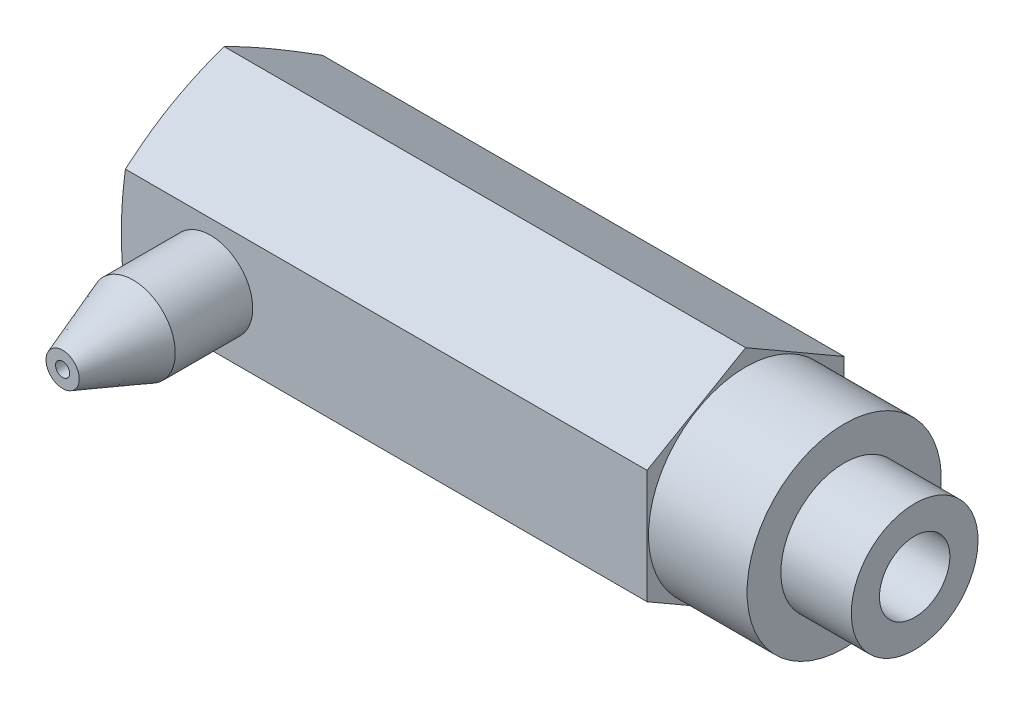
ISO-10303-21;
HEADER;
FILE_DESCRIPTION(('STEP AP214'),'2;1');
FILE_NAME('part.step','',(''),(''),'','','');
FILE_SCHEMA(('AUTOMOTIVE_DESIGN { 1 0 10303 214 1 1 1 1 }'));
ENDSEC;
DATA;
#1=APPLICATION_CONTEXT('core data for automotive mechanical design processes');
#2=APPLICATION_PROTOCOL_DEFINITION('international standard','automotive_design',2000,#1);
#3=PRODUCT_CONTEXT('',#1,'mechanical');
#4=PRODUCT('Part','Part','',(#3));
#5=PRODUCT_RELATED_PRODUCT_CATEGORY('part','',(#4));
#6=PRODUCT_DEFINITION_FORMATION('','',#4);
#7=PRODUCT_DEFINITION_CONTEXT('part definition',#1,'design');
#8=PRODUCT_DEFINITION('design','',#6,#7);
#9=PRODUCT_DEFINITION_SHAPE('','',#8);
#10=(LENGTH_UNIT() NAMED_UNIT(*) SI_UNIT(.MILLI.,.METRE.));
#11=(NAMED_UNIT(*) PLANE_ANGLE_UNIT() SI_UNIT($,.RADIAN.));
#12=(NAMED_UNIT(*) SI_UNIT($,.STERADIAN.) SOLID_ANGLE_UNIT());
#13=UNCERTAINTY_MEASURE_WITH_UNIT(LENGTH_MEASURE(1.E-05),#10,'distance_accuracy_value','');
#14=(GEOMETRIC_REPRESENTATION_CONTEXT(3) GLOBAL_UNCERTAINTY_ASSIGNED_CONTEXT((#13)) GLOBAL_UNIT_ASSIGNED_CONTEXT((#10,
#11,#12)) REPRESENTATION_CONTEXT('',''));
#15=CARTESIAN_POINT('',(0.,0.,0.));
#16=DIRECTION('',(0.,0.,1.));
#17=DIRECTION('',(1.,0.,0.));
#18=AXIS2_PLACEMENT_3D('',#15,#16,#17);
#19=CARTESIAN_POINT('',(0.,-12.1243556529821,-7.00000000000001));
#20=DIRECTION('',(1.,0.,0.));
#21=DIRECTION('',(0.,1.,0.));
#22=AXIS2_PLACEMENT_3D('',#19,#20,#21);
#23=PLANE('',#22);
#24=CARTESIAN_POINT('',(2.84220346910558E-11,0.,0.));
#25=DIRECTION('',(1.,0.,0.));
#26=DIRECTION('',(0.,0.,-1.));
#27=AXIS2_PLACEMENT_3D('',#24,#25,#26);
#28=CIRCLE('',#27,4.50000000000728);
#29=CARTESIAN_POINT('',(2.84220346910558E-11,0.,-4.50000000000728));
#30=VERTEX_POINT('',#29);
#31=EDGE_CURVE('E21',#30,#30,#28,.T.);
#32=ORIENTED_EDGE('',*,*,#31,.F.);
#33=EDGE_LOOP('',(#32));
#34=FACE_BOUND('',#33,.T.);
#35=ADVANCED_FACE('F18',(#34),#23,.F.);
#36=CARTESIAN_POINT('',(0.965796388413764,0.,0.));
#37=DIRECTION('',(1.,0.,0.));
#38=DIRECTION('',(0.,0.,-1.));
#39=AXIS2_PLACEMENT_3D('',#36,#37,#38);
#40=CONICAL_SURFACE('',#39,8.10440119124678,1.30899693899706);
#41=ORIENTED_EDGE('',*,*,#31,.T.);
#42=EDGE_LOOP('',(#41));
#43=FACE_BOUND('',#42,.T.);
#44=CARTESIAN_POINT('',(0.960036171390529,-8.08290376865333,2.45904720954475E-12));
#45=CARTESIAN_POINT('',(0.915048871987768,-7.91507240446687,0.290692449876997));
#46=CARTESIAN_POINT('',(0.874207965908697,-7.7469367613631,0.581911926296008));
#47=CARTESIAN_POINT('',(0.802454490572628,-7.41007174498889,1.16537924994865));
#48=CARTESIAN_POINT('',(0.771545953213827,-7.24134215864227,1.45762746624108));
#49=CARTESIAN_POINT('',(0.721461485342798,-6.90431216735326,2.04138053482815));
#50=CARTESIAN_POINT('',(0.702225832356052,-6.736014040957,2.33288144056511));
#51=CARTESIAN_POINT('',(0.676432806463181,-6.39920318665398,2.91625495275862));
#52=CARTESIAN_POINT('',(0.669872981100767,-6.23069050657251,3.20812747637934));
#53=CARTESIAN_POINT('',(0.669872981100769,-5.89366514640956,3.79187252362077));
#54=CARTESIAN_POINT('',(0.676432806463184,-5.72515246632808,4.08374504724148));
#55=CARTESIAN_POINT('',(0.702225832356058,-5.38834161202506,4.66711855943499));
#56=CARTESIAN_POINT('',(0.721461485342807,-5.22004348562881,4.95861946517195));
#57=CARTESIAN_POINT('',(0.771545953213838,-4.8830134943398,5.54237253375902));
#58=CARTESIAN_POINT('',(0.802454490572641,-4.71428390799317,5.83462075005145));
#59=CARTESIAN_POINT('',(0.874207965908712,-4.37741889161897,6.41808807370409));
#60=CARTESIAN_POINT('',(0.915048871987785,-4.20928324851519,6.7093075501231));
#61=CARTESIAN_POINT('',(0.960036171390547,-4.04145188432874,6.99999999999764));
#62=B_SPLINE_CURVE_WITH_KNOTS('',3,(#44,#45,#46,#47,#48,#49,#50,#51,#52,#53,#54,#55,#56,#57,#58,
#59,#60,#61),.UNSPECIFIED.,.F.,.F.,(4,2,2,2,2,2,2,2,4),(0.,1.01604530703988,2.0325025431513,
3.04371439847408,4.05473058994357,5.06574678141305,6.07695863673583,7.09341587284725,
8.10946117988713),.UNSPECIFIED.);
#63=CARTESIAN_POINT('',(0.960036171390716,-8.08290376865403,1.22941724914971E-12));
#64=VERTEX_POINT('',#63);
#65=CARTESIAN_POINT('',(0.960036171390543,-4.04145188432661,6.99999999999885));
#66=VERTEX_POINT('',#65);
#67=EDGE_CURVE('E67',#64,#66,#62,.T.);
#68=ORIENTED_EDGE('',*,*,#67,.T.);
#69=CARTESIAN_POINT('',(0.960036171390538,-4.04145188432448,7.00000000000006));
#70=CARTESIAN_POINT('',(0.915048871987779,-3.70578915595158,7.00000000000006));
#71=CARTESIAN_POINT('',(0.87420796590871,-3.36951786974403,7.00000000000006));
#72=CARTESIAN_POINT('',(0.802454490572644,-2.69578783699564,7.00000000000006));
#73=CARTESIAN_POINT('',(0.771545953213844,-2.3583286643024,7.00000000000006));
#74=CARTESIAN_POINT('',(0.721461485342818,-1.6842686817244,7.00000000000006));
#75=CARTESIAN_POINT('',(0.702225832356071,-1.3476724289319,7.00000000000006));
#76=CARTESIAN_POINT('',(0.676432806463201,-0.674050720325877,7.00000000000006));
#77=CARTESIAN_POINT('',(0.669872981100787,-0.337025360162938,7.00000000000006));
#78=CARTESIAN_POINT('',(0.669872981100787,0.337025360162938,7.00000000000006));
#79=CARTESIAN_POINT('',(0.676432806463201,0.674050720325876,7.00000000000006));
#80=CARTESIAN_POINT('',(0.702225832356071,1.3476724289319,7.00000000000006));
#81=CARTESIAN_POINT('',(0.721461485342817,1.68426868172439,7.00000000000006));
#82=CARTESIAN_POINT('',(0.771545953213844,2.3583286643024,7.00000000000006));
#83=CARTESIAN_POINT('',(0.802454490572643,2.69578783699563,7.00000000000006));
#84=CARTESIAN_POINT('',(0.874207965908709,3.36951786974402,7.00000000000006));
#85=CARTESIAN_POINT('',(0.915048871987778,3.70578915595157,7.00000000000006));
#86=CARTESIAN_POINT('',(0.960036171390536,4.04145188432447,7.00000000000006));
#87=B_SPLINE_CURVE_WITH_KNOTS('',3,(#69,#70,#71,#72,#73,#74,#75,#76,#77,#78,#79,#80,#81,#82,#83,
#84,#85,#86),.UNSPECIFIED.,.F.,.F.,(4,2,2,2,2,2,2,2,4),(0.,1.01604530703985,2.03250254315124,
3.04371439847399,4.05473058994345,5.0657467814129,6.07695863673565,7.09341587284703,
8.10946117988688),.UNSPECIFIED.);
#88=CARTESIAN_POINT('',(0.960036171390735,4.04145188432801,6.99999999999887));
#89=VERTEX_POINT('',#88);
#90=EDGE_CURVE('E128',#66,#89,#87,.T.);
#91=ORIENTED_EDGE('',*,*,#90,.T.);
#92=CARTESIAN_POINT('',(0.96003617139056,4.04145188432878,6.99999999999767));
#93=CARTESIAN_POINT('',(0.915048871987798,4.20928324851523,6.70930755012314));
#94=CARTESIAN_POINT('',(0.874207965908726,4.37741889161901,6.41808807370413));
#95=CARTESIAN_POINT('',(0.802454490572654,4.71428390799321,5.83462075005149));
#96=CARTESIAN_POINT('',(0.771545953213852,4.88301349433983,5.54237253375905));
#97=CARTESIAN_POINT('',(0.721461485342821,5.22004348562885,4.95861946517199));
#98=CARTESIAN_POINT('',(0.702225832356073,5.3883416120251,4.66711855943503));
#99=CARTESIAN_POINT('',(0.676432806463198,5.72515246632812,4.08374504724152));
#100=CARTESIAN_POINT('',(0.669872981100783,5.8936651464096,3.7918725236208));
#101=CARTESIAN_POINT('',(0.669872981100781,6.23069050657254,3.20812747637938));
#102=CARTESIAN_POINT('',(0.676432806463195,6.39920318665402,2.91625495275867));
#103=CARTESIAN_POINT('',(0.702225832356065,6.73601404095704,2.33288144056516));
#104=CARTESIAN_POINT('',(0.721461485342811,6.90431216735329,2.04138053482819));
#105=CARTESIAN_POINT('',(0.771545953213839,7.24134215864231,1.45762746624113));
#106=CARTESIAN_POINT('',(0.802454490572639,7.41007174498893,1.1653792499487));
#107=CARTESIAN_POINT('',(0.874207965908707,7.74693676136313,0.581911926296054));
#108=CARTESIAN_POINT('',(0.915048871987778,7.91507240446691,0.290692449877043));
#109=CARTESIAN_POINT('',(0.960036171390539,8.08290376865336,2.5059798162903E-12));
#110=B_SPLINE_CURVE_WITH_KNOTS('',3,(#92,#93,#94,#95,#96,#97,#98,#99,#100,#101,#102,#103,#104,
#105,#106,#107,#108,#109),.UNSPECIFIED.,.F.,.F.,(4,2,2,2,2,2,2,2,4),(0.,1.01604530703988,
2.03250254315129,3.04371439847407,4.05473058994356,5.06574678141304,6.07695863673582,
7.09341587284723,8.10946117988712),.UNSPECIFIED.);
#111=CARTESIAN_POINT('',(0.960036171390728,8.08290376865407,-1.16869140979691E-12));
#112=VERTEX_POINT('',#111);
#113=EDGE_CURVE('E116',#89,#112,#110,.T.);
#114=ORIENTED_EDGE('',*,*,#113,.T.);
#115=CARTESIAN_POINT('',(0.960036171390538,8.08290376865336,-2.39294052244843E-12));
#116=CARTESIAN_POINT('',(0.915048871987777,7.91507240446691,-0.29069244987693));
#117=CARTESIAN_POINT('',(0.874207965908704,7.74693676136313,-0.581911926295942));
#118=CARTESIAN_POINT('',(0.802454490572634,7.41007174498893,-1.16537924994859));
#119=CARTESIAN_POINT('',(0.771545953213832,7.2413421586423,-1.45762746624102));
#120=CARTESIAN_POINT('',(0.721461485342801,6.90431216735329,-2.04138053482809));
#121=CARTESIAN_POINT('',(0.702225832356054,6.73601404095703,-2.33288144056505));
#122=CARTESIAN_POINT('',(0.676432806463181,6.39920318665401,-2.91625495275856));
#123=CARTESIAN_POINT('',(0.669872981100767,6.23069050657254,-3.20812747637928));
#124=CARTESIAN_POINT('',(0.669872981100767,5.89366514640959,-3.7918725236207));
#125=CARTESIAN_POINT('',(0.676432806463181,5.72515246632811,-4.08374504724142));
#126=CARTESIAN_POINT('',(0.702225832356054,5.38834161202509,-4.66711855943493));
#127=CARTESIAN_POINT('',(0.721461485342801,5.22004348562884,-4.95861946517189));
#128=CARTESIAN_POINT('',(0.771545953213831,4.88301349433982,-5.54237253375896));
#129=CARTESIAN_POINT('',(0.802454490572633,4.7142839079932,-5.83462075005139));
#130=CARTESIAN_POINT('',(0.874207965908703,4.377418891619,-6.41808807370404));
#131=CARTESIAN_POINT('',(0.915048871987775,4.20928324851522,-6.70930755012305));
#132=CARTESIAN_POINT('',(0.960036171390537,4.04145188432876,-6.99999999999759));
#133=B_SPLINE_CURVE_WITH_KNOTS('',3,(#115,#116,#117,#118,#119,#120,#121,#122,#123,#124,#125,
#126,#127,#128,#129,#130,#131,#132),.UNSPECIFIED.,.F.,.F.,(4,2,2,2,2,2,2,2,4),(0.,
1.01604530703988,2.0325025431513,3.04371439847408,4.05473058994357,5.06574678141306,
6.07695863673584,7.09341587284726,8.10946117988714),.UNSPECIFIED.);
#134=CARTESIAN_POINT('',(0.960036171390732,4.04145188432595,-7.00000000000005));
#135=VERTEX_POINT('',#134);
#136=EDGE_CURVE('E123',#112,#135,#133,.T.);
#137=ORIENTED_EDGE('',*,*,#136,.T.);
#138=CARTESIAN_POINT('',(0.960036171390552,4.04145188432453,-7.00000000000009));
#139=CARTESIAN_POINT('',(0.915048871987792,3.70578915595163,-7.00000000000009));
#140=CARTESIAN_POINT('',(0.874207965908722,3.36951786974408,-7.00000000000009));
#141=CARTESIAN_POINT('',(0.802454490572654,2.69578783699568,-7.00000000000009));
#142=CARTESIAN_POINT('',(0.771545953213854,2.35832866430244,-7.00000000000009));
#143=CARTESIAN_POINT('',(0.721461485342826,1.68426868172442,-7.00000000000009));
#144=CARTESIAN_POINT('',(0.702225832356079,1.34767242893192,-7.00000000000009));
#145=CARTESIAN_POINT('',(0.676432806463208,0.674050720325887,-7.00000000000009));
#146=CARTESIAN_POINT('',(0.669872981100794,0.337025360162944,-7.00000000000009));
#147=CARTESIAN_POINT('',(0.669872981100794,-0.33702536016294,-7.00000000000009));
#148=CARTESIAN_POINT('',(0.676432806463208,-0.67405072032588,-7.00000000000009));
#149=CARTESIAN_POINT('',(0.702225832356079,-1.34767242893191,-7.00000000000009));
#150=CARTESIAN_POINT('',(0.721461485342825,-1.68426868172441,-7.00000000000009));
#151=CARTESIAN_POINT('',(0.771545953213852,-2.35832866430241,-7.00000000000009));
#152=CARTESIAN_POINT('',(0.802454490572652,-2.69578783699565,-7.00000000000009));
#153=CARTESIAN_POINT('',(0.874207965908718,-3.36951786974404,-7.00000000000009));
#154=CARTESIAN_POINT('',(0.915048871987788,-3.70578915595159,-7.00000000000009));
#155=CARTESIAN_POINT('',(0.960036171390547,-4.04145188432449,-7.00000000000009));
#156=B_SPLINE_CURVE_WITH_KNOTS('',3,(#138,#139,#140,#141,#142,#143,#144,#145,#146,#147,#148,
#149,#150,#151,#152,#153,#154,#155),.UNSPECIFIED.,.F.,.F.,(4,2,2,2,2,2,2,2,4),(0.,
1.01604530703987,2.03250254315127,3.04371439847403,4.0547305899435,5.06574678141296,
6.07695863673572,7.09341587284711,8.10946117988697),.UNSPECIFIED.);
#157=CARTESIAN_POINT('',(0.960036171390733,-4.04145188432803,-6.99999999999886));
#158=VERTEX_POINT('',#157);
#159=EDGE_CURVE('E88',#135,#158,#156,.T.);
#160=ORIENTED_EDGE('',*,*,#159,.T.);
#161=CARTESIAN_POINT('',(0.96003617139054,-4.04145188432872,-6.99999999999762));
#162=CARTESIAN_POINT('',(0.915048871987778,-4.20928324851517,-6.70930755012309));
#163=CARTESIAN_POINT('',(0.874207965908705,-4.37741889161895,-6.41808807370407));
#164=CARTESIAN_POINT('',(0.802454490572633,-4.71428390799315,-5.83462075005143));
#165=CARTESIAN_POINT('',(0.771545953213831,-4.88301349433978,-5.542372533759));
#166=CARTESIAN_POINT('',(0.7214614853428,-5.22004348562879,-4.95861946517193));
#167=CARTESIAN_POINT('',(0.702225832356051,-5.38834161202504,-4.66711855943497));
#168=CARTESIAN_POINT('',(0.676432806463177,-5.72515246632807,-4.08374504724146));
#169=CARTESIAN_POINT('',(0.669872981100762,-5.89366514640954,-3.79187252362075));
#170=CARTESIAN_POINT('',(0.669872981100761,-6.23069050657249,-3.20812747637932));
#171=CARTESIAN_POINT('',(0.676432806463175,-6.39920318665396,-2.9162549527586));
#172=CARTESIAN_POINT('',(0.702225832356046,-6.73601404095699,-2.33288144056509));
#173=CARTESIAN_POINT('',(0.721461485342793,-6.90431216735324,-2.04138053482813));
#174=CARTESIAN_POINT('',(0.771545953213822,-7.24134215864225,-1.45762746624107));
#175=CARTESIAN_POINT('',(0.802454490572623,-7.41007174498888,-1.16537924994863));
#176=CARTESIAN_POINT('',(0.874207965908693,-7.74693676136308,-0.581911926295988));
#177=CARTESIAN_POINT('',(0.915048871987765,-7.91507240446686,-0.290692449876977));
#178=CARTESIAN_POINT('',(0.960036171390526,-8.08290376865332,-2.4399795749603E-12));
#179=B_SPLINE_CURVE_WITH_KNOTS('',3,(#161,#162,#163,#164,#165,#166,#167,#168,#169,#170,#171,
#172,#173,#174,#175,#176,#177,#178),.UNSPECIFIED.,.F.,.F.,(4,2,2,2,2,2,2,2,4),(0.,
1.01604530703988,2.0325025431513,3.04371439847408,4.05473058994357,5.06574678141306,
6.07695863673584,7.09341587284725,8.10946117988713),.UNSPECIFIED.);
#180=EDGE_CURVE('E82',#158,#64,#179,.T.);
#181=ORIENTED_EDGE('',*,*,#180,.T.);
#182=EDGE_LOOP('',(#68,#91,#114,#137,#160,#181));
#183=FACE_BOUND('',#182,.T.);
#184=ADVANCED_FACE('F86',(#43,#183),#40,.T.);
#185=CARTESIAN_POINT('',(50.,-4.04145188432731,7.00000000000012));
#186=DIRECTION('',(0.,0.866025403784439,-0.5));
#187=DIRECTION('',(0.,0.5,0.866025403784439));
#188=AXIS2_PLACEMENT_3D('',#185,#186,#187);
#189=PLANE('',#188);
#190=DIRECTION('',(1.,0.,0.));
#191=VECTOR('',#190,1.);
#192=CARTESIAN_POINT('',(50.,-8.08290376865473,0.));
#193=LINE('',#192,#191);
#194=CARTESIAN_POINT('',(38.,-8.08290376865473,0.));
#195=VERTEX_POINT('',#194);
#196=EDGE_CURVE('E71',#64,#195,#193,.T.);
#197=ORIENTED_EDGE('',*,*,#196,.T.);
#198=DIRECTION('',(0.,-0.499999999999997,-0.86602540378444));
#199=VECTOR('',#198,1.);
#200=CARTESIAN_POINT('',(38.,-4.04145188432731,7.00000000000012));
#201=LINE('',#200,#199);
#202=CARTESIAN_POINT('',(38.,-4.04145188432731,7.00000000000006));
#203=VERTEX_POINT('',#202);
#204=EDGE_CURVE('E252',#203,#195,#201,.T.);
#205=ORIENTED_EDGE('',*,*,#204,.F.);
#206=DIRECTION('',(1.,0.,0.));
#207=VECTOR('',#206,1.);
#208=CARTESIAN_POINT('',(50.,-4.04145188432731,7.00000000000006));
#209=LINE('',#208,#207);
#210=EDGE_CURVE('E74',#203,#66,#209,.F.);
#211=ORIENTED_EDGE('',*,*,#210,.T.);
#212=ORIENTED_EDGE('',*,*,#67,.F.);
#213=EDGE_LOOP('',(#197,#205,#211,#212));
#214=FACE_BOUND('',#213,.T.);
#215=ADVANCED_FACE('F69',(#214),#189,.F.);
#216=CARTESIAN_POINT('',(50.,-8.08290376865473,0.));
#217=DIRECTION('',(0.,0.866025403784439,0.5));
#218=DIRECTION('',(0.,-0.5,0.866025403784439));
#219=AXIS2_PLACEMENT_3D('',#216,#217,#218);
#220=PLANE('',#219);
#221=DIRECTION('',(1.,0.,0.));
#222=VECTOR('',#221,1.);
#223=CARTESIAN_POINT('',(50.,-4.04145188432734,-7.00000000000009));
#224=LINE('',#223,#222);
#225=CARTESIAN_POINT('',(38.,-4.04145188432733,-7.00000000000009));
#226=VERTEX_POINT('',#225);
#227=EDGE_CURVE('E89',#158,#226,#224,.T.);
#228=ORIENTED_EDGE('',*,*,#227,.T.);
#229=DIRECTION('',(0.,0.499999999999996,-0.866025403784441));
#230=VECTOR('',#229,1.);
#231=CARTESIAN_POINT('',(38.,-8.08290376865473,0.));
#232=LINE('',#231,#230);
#233=EDGE_CURVE('E84',#195,#226,#232,.T.);
#234=ORIENTED_EDGE('',*,*,#233,.F.);
#235=ORIENTED_EDGE('',*,*,#196,.F.);
#236=ORIENTED_EDGE('',*,*,#180,.F.);
#237=EDGE_LOOP('',(#228,#234,#235,#236));
#238=FACE_BOUND('',#237,.T.);
#239=ADVANCED_FACE('F81',(#238),#220,.F.);
#240=CARTESIAN_POINT('',(50.,-4.04145188432734,-7.00000000000009));
#241=DIRECTION('',(0.,0.,1.));
#242=DIRECTION('',(0.,-1.,0.));
#243=AXIS2_PLACEMENT_3D('',#240,#241,#242);
#244=PLANE('',#243);
#245=DIRECTION('',(1.,0.,0.));
#246=VECTOR('',#245,1.);
#247=CARTESIAN_POINT('',(50.,4.04145188432736,-7.00000000000001));
#248=LINE('',#247,#246);
#249=CARTESIAN_POINT('',(38.,4.04145188432735,-7.00000000000003));
#250=VERTEX_POINT('',#249);
#251=EDGE_CURVE('E242',#135,#250,#248,.T.);
#252=ORIENTED_EDGE('',*,*,#251,.T.);
#253=DIRECTION('',(0.,1.,0.));
#254=VECTOR('',#253,1.);
#255=CARTESIAN_POINT('',(38.,-4.04145188432731,-7.00000000000009));
#256=LINE('',#255,#254);
#257=EDGE_CURVE('E263',#226,#250,#256,.T.);
#258=ORIENTED_EDGE('',*,*,#257,.F.);
#259=ORIENTED_EDGE('',*,*,#227,.F.);
#260=ORIENTED_EDGE('',*,*,#159,.F.);
#261=EDGE_LOOP('',(#252,#258,#259,#260));
#262=FACE_BOUND('',#261,.T.);
#263=ADVANCED_FACE('F151',(#262),#244,.F.);
#264=CARTESIAN_POINT('',(50.,4.04145188432736,-7.00000000000001));
#265=DIRECTION('',(0.,-0.866025403784439,0.5));
#266=DIRECTION('',(0.,-0.5,-0.866025403784439));
#267=AXIS2_PLACEMENT_3D('',#264,#265,#266);
#268=PLANE('',#267);
#269=DIRECTION('',(1.,0.,0.));
#270=VECTOR('',#269,1.);
#271=CARTESIAN_POINT('',(50.,8.08290376865478,0.));
#272=LINE('',#271,#270);
#273=CARTESIAN_POINT('',(38.,8.08290376865478,0.));
#274=VERTEX_POINT('',#273);
#275=EDGE_CURVE('E238',#112,#274,#272,.T.);
#276=ORIENTED_EDGE('',*,*,#275,.T.);
#277=DIRECTION('',(0.,0.5,0.866025403784438));
#278=VECTOR('',#277,1.);
#279=CARTESIAN_POINT('',(38.,4.04145188432736,-7.00000000000001));
#280=LINE('',#279,#278);
#281=EDGE_CURVE('E36',#250,#274,#280,.T.);
#282=ORIENTED_EDGE('',*,*,#281,.F.);
#283=ORIENTED_EDGE('',*,*,#251,.F.);
#284=ORIENTED_EDGE('',*,*,#136,.F.);
#285=EDGE_LOOP('',(#276,#282,#283,#284));
#286=FACE_BOUND('',#285,.T.);
#287=ADVANCED_FACE('F147',(#286),#268,.F.);
#288=CARTESIAN_POINT('',(50.,8.08290376865478,0.));
#289=DIRECTION('',(0.,-0.866025403784439,-0.5));
#290=DIRECTION('',(0.,0.5,-0.866025403784439));
#291=AXIS2_PLACEMENT_3D('',#288,#289,#290);
#292=PLANE('',#291);
#293=DIRECTION('',(1.,0.,0.));
#294=VECTOR('',#293,1.);
#295=CARTESIAN_POINT('',(50.,4.04145188432725,7.00000000000006));
#296=LINE('',#295,#294);
#297=CARTESIAN_POINT('',(38.,4.04145188432727,7.00000000000006));
#298=VERTEX_POINT('',#297);
#299=EDGE_CURVE('E231',#89,#298,#296,.T.);
#300=ORIENTED_EDGE('',*,*,#299,.T.);
#301=DIRECTION('',(0.,-0.500000000000013,0.866025403784431));
#302=VECTOR('',#301,1.);
#303=CARTESIAN_POINT('',(38.,8.08290376865478,0.));
#304=LINE('',#303,#302);
#305=EDGE_CURVE('E258',#274,#298,#304,.T.);
#306=ORIENTED_EDGE('',*,*,#305,.F.);
#307=ORIENTED_EDGE('',*,*,#275,.F.);
#308=ORIENTED_EDGE('',*,*,#113,.F.);
#309=EDGE_LOOP('',(#300,#306,#307,#308));
#310=FACE_BOUND('',#309,.T.);
#311=ADVANCED_FACE('F142',(#310),#292,.F.);
#312=CARTESIAN_POINT('',(50.,4.04145188432725,7.00000000000006));
#313=DIRECTION('',(0.,0.,-1.));
#314=DIRECTION('',(0.,1.,0.));
#315=AXIS2_PLACEMENT_3D('',#312,#313,#314);
#316=PLANE('',#315);
#317=ORIENTED_EDGE('',*,*,#210,.F.);
#318=DIRECTION('',(0.,1.,0.));
#319=VECTOR('',#318,1.);
#320=CARTESIAN_POINT('',(38.,-4.04145188432731,7.00000000000006));
#321=LINE('',#320,#319);
#322=EDGE_CURVE('E134',#298,#203,#321,.F.);
#323=ORIENTED_EDGE('',*,*,#322,.F.);
#324=ORIENTED_EDGE('',*,*,#299,.F.);
#325=ORIENTED_EDGE('',*,*,#90,.F.);
#326=EDGE_LOOP('',(#317,#323,#324,#325));
#327=FACE_BOUND('',#326,.T.);
#328=CARTESIAN_POINT('',(7.00000000000001,0.,7.00000000000001));
#329=DIRECTION('',(0.,0.,-1.));
#330=DIRECTION('',(0.,1.,0.));
#331=AXIS2_PLACEMENT_3D('',#328,#329,#330);
#332=CIRCLE('',#331,3.);
#333=CARTESIAN_POINT('',(7.00000000000001,2.99999999999997,7.00000000000001));
#334=VERTEX_POINT('',#333);
#335=EDGE_CURVE('E135',#334,#334,#332,.F.);
#336=ORIENTED_EDGE('',*,*,#335,.F.);
#337=EDGE_LOOP('',(#336));
#338=FACE_BOUND('',#337,.T.);
#339=ADVANCED_FACE('F137',(#327,#338),#316,.F.);
#340=CARTESIAN_POINT('',(38.,-4.04145188432731,7.00000000000012));
#341=DIRECTION('',(1.,0.,0.));
#342=DIRECTION('',(0.,1.,0.));
#343=AXIS2_PLACEMENT_3D('',#340,#341,#342);
#344=PLANE('',#343);
#345=ORIENTED_EDGE('',*,*,#281,.T.);
#346=ORIENTED_EDGE('',*,*,#305,.T.);
#347=ORIENTED_EDGE('',*,*,#322,.T.);
#348=ORIENTED_EDGE('',*,*,#204,.T.);
#349=ORIENTED_EDGE('',*,*,#233,.T.);
#350=ORIENTED_EDGE('',*,*,#257,.T.);
#351=EDGE_LOOP('',(#345,#346,#347,#348,#349,#350));
#352=FACE_BOUND('',#351,.T.);
#353=CARTESIAN_POINT('',(38.,0.,0.));
#354=DIRECTION('',(1.,0.,0.));
#355=DIRECTION('',(0.,1.,0.));
#356=AXIS2_PLACEMENT_3D('',#353,#354,#355);
#357=CIRCLE('',#356,6.90000000000001);
#358=CARTESIAN_POINT('',(38.,6.90000000000001,0.));
#359=VERTEX_POINT('',#358);
#360=EDGE_CURVE('E223',#359,#359,#357,.T.);
#361=ORIENTED_EDGE('',*,*,#360,.F.);
#362=EDGE_LOOP('',(#361));
#363=FACE_BOUND('',#362,.T.);
#364=ADVANCED_FACE('F141',(#352,#363),#344,.T.);
#365=CARTESIAN_POINT('',(7.00000000000001,0.,17.5));
#366=DIRECTION('',(0.,0.,-1.));
#367=DIRECTION('',(0.,1.,0.));
#368=AXIS2_PLACEMENT_3D('',#365,#366,#367);
#369=CYLINDRICAL_SURFACE('',#368,3.);
#370=ORIENTED_EDGE('',*,*,#335,.T.);
#371=EDGE_LOOP('',(#370));
#372=FACE_BOUND('',#371,.T.);
#373=CARTESIAN_POINT('',(7.00000000000001,0.,12.5000000000455));
#374=DIRECTION('',(0.,0.,-1.));
#375=DIRECTION('',(-1.,0.,0.));
#376=AXIS2_PLACEMENT_3D('',#373,#374,#375);
#377=CIRCLE('',#376,2.99999999998091);
#378=CARTESIAN_POINT('',(4.0000000000191,0.,12.5000000000455));
#379=VERTEX_POINT('',#378);
#380=EDGE_CURVE('E221',#379,#379,#377,.F.);
#381=ORIENTED_EDGE('',*,*,#380,.F.);
#382=EDGE_LOOP('',(#381));
#383=FACE_BOUND('',#382,.T.);
#384=ADVANCED_FACE('F209',(#372,#383),#369,.T.);
#385=CARTESIAN_POINT('',(38.,0.,0.));
#386=DIRECTION('',(1.,0.,0.));
#387=DIRECTION('',(0.,1.,0.));
#388=AXIS2_PLACEMENT_3D('',#385,#386,#387);
#389=CYLINDRICAL_SURFACE('',#388,6.90000000000001);
#390=ORIENTED_EDGE('',*,*,#360,.T.);
#391=EDGE_LOOP('',(#390));
#392=FACE_BOUND('',#391,.T.);
#393=CARTESIAN_POINT('',(45.,0.,0.));
#394=DIRECTION('',(1.,0.,0.));
#395=DIRECTION('',(0.,1.,0.));
#396=AXIS2_PLACEMENT_3D('',#393,#394,#395);
#397=CIRCLE('',#396,6.90000000000001);
#398=CARTESIAN_POINT('',(45.,6.90000000000001,0.));
#399=VERTEX_POINT('',#398);
#400=EDGE_CURVE('E222',#399,#399,#397,.T.);
#401=ORIENTED_EDGE('',*,*,#400,.F.);
#402=EDGE_LOOP('',(#401));
#403=FACE_BOUND('',#402,.T.);
#404=ADVANCED_FACE('F206',(#392,#403),#389,.T.);
#405=CARTESIAN_POINT('',(7.00000000000001,0.,12.5000000000455));
#406=DIRECTION('',(0.,0.,-1.));
#407=DIRECTION('',(-1.,0.,0.));
#408=AXIS2_PLACEMENT_3D('',#405,#406,#407);
#409=CONICAL_SURFACE('',#408,2.99999999998091,0.349065850400769);
#410=ORIENTED_EDGE('',*,*,#380,.T.);
#411=EDGE_LOOP('',(#410));
#412=FACE_BOUND('',#411,.T.);
#413=CARTESIAN_POINT('',(7.00000000000001,0.,17.4999999999841));
#414=DIRECTION('',(0.,0.,-1.));
#415=DIRECTION('',(-1.,0.,0.));
#416=AXIS2_PLACEMENT_3D('',#413,#414,#415);
#417=CIRCLE('',#416,1.18014882866146);
#418=CARTESIAN_POINT('',(5.81985117133854,0.,17.4999999999841));
#419=VERTEX_POINT('',#418);
#420=EDGE_CURVE('E226',#419,#419,#417,.F.);
#421=ORIENTED_EDGE('',*,*,#420,.F.);
#422=EDGE_LOOP('',(#421));
#423=FACE_BOUND('',#422,.T.);
#424=ADVANCED_FACE('F202',(#412,#423),#409,.T.);
#425=CARTESIAN_POINT('',(45.,0.,0.));
#426=DIRECTION('',(1.,0.,0.));
#427=DIRECTION('',(0.,1.,0.));
#428=AXIS2_PLACEMENT_3D('',#425,#426,#427);
#429=PLANE('',#428);
#430=ORIENTED_EDGE('',*,*,#400,.T.);
#431=EDGE_LOOP('',(#430));
#432=FACE_BOUND('',#431,.T.);
#433=CARTESIAN_POINT('',(45.,0.,0.));
#434=DIRECTION('',(1.,0.,0.));
#435=DIRECTION('',(0.,1.,0.));
#436=AXIS2_PLACEMENT_3D('',#433,#434,#435);
#437=CIRCLE('',#436,4.50000000000001);
#438=CARTESIAN_POINT('',(45.,4.50000000000001,0.));
#439=VERTEX_POINT('',#438);
#440=EDGE_CURVE('E287',#439,#439,#437,.T.);
#441=ORIENTED_EDGE('',*,*,#440,.F.);
#442=EDGE_LOOP('',(#441));
#443=FACE_BOUND('',#442,.T.);
#444=ADVANCED_FACE('F198',(#432,#443),#429,.T.);
#445=CARTESIAN_POINT('',(7.00000000000001,0.,17.5));
#446=DIRECTION('',(0.,0.,1.));
#447=DIRECTION('',(0.,-1.,0.));
#448=AXIS2_PLACEMENT_3D('',#445,#446,#447);
#449=PLANE('',#448);
#450=ORIENTED_EDGE('',*,*,#420,.T.);
#451=EDGE_LOOP('',(#450));
#452=FACE_BOUND('',#451,.T.);
#453=CARTESIAN_POINT('',(7.00000000000001,0.,17.5));
#454=DIRECTION('',(0.,0.,1.));
#455=DIRECTION('',(0.,-1.,0.));
#456=AXIS2_PLACEMENT_3D('',#453,#454,#455);
#457=CIRCLE('',#456,0.5);
#458=CARTESIAN_POINT('',(7.00000000000001,-0.499999999999999,17.5));
#459=VERTEX_POINT('',#458);
#460=EDGE_CURVE('E288',#459,#459,#457,.F.);
#461=ORIENTED_EDGE('',*,*,#460,.T.);
#462=EDGE_LOOP('',(#461));
#463=FACE_BOUND('',#462,.T.);
#464=ADVANCED_FACE('F194',(#452,#463),#449,.T.);
#465=CARTESIAN_POINT('',(45.,0.,0.));
#466=DIRECTION('',(1.,0.,0.));
#467=DIRECTION('',(0.,1.,0.));
#468=AXIS2_PLACEMENT_3D('',#465,#466,#467);
#469=CYLINDRICAL_SURFACE('',#468,4.50000000000001);
#470=ORIENTED_EDGE('',*,*,#440,.T.);
#471=EDGE_LOOP('',(#470));
#472=FACE_BOUND('',#471,.T.);
#473=CARTESIAN_POINT('',(50.,0.,0.));
#474=DIRECTION('',(1.,0.,0.));
#475=DIRECTION('',(0.,1.,0.));
#476=AXIS2_PLACEMENT_3D('',#473,#474,#475);
#477=CIRCLE('',#476,4.50000000000001);
#478=CARTESIAN_POINT('',(50.,4.50000000000001,0.));
#479=VERTEX_POINT('',#478);
#480=EDGE_CURVE('E184',#479,#479,#477,.T.);
#481=ORIENTED_EDGE('',*,*,#480,.F.);
#482=EDGE_LOOP('',(#481));
#483=FACE_BOUND('',#482,.T.);
#484=ADVANCED_FACE('F190',(#472,#483),#469,.T.);
#485=CARTESIAN_POINT('',(7.00000000000001,0.,0.));
#486=DIRECTION('',(0.,0.,1.));
#487=DIRECTION('',(0.,-1.,0.));
#488=AXIS2_PLACEMENT_3D('',#485,#486,#487);
#489=CYLINDRICAL_SURFACE('',#488,0.5);
#490=ORIENTED_EDGE('',*,*,#460,.F.);
#491=EDGE_LOOP('',(#490));
#492=FACE_BOUND('',#491,.T.);
#493=CARTESIAN_POINT('',(7.50000000000001,0.,2.5));
#494=CARTESIAN_POINT('',(7.4999980344444,-0.02776922937312,2.49999916183991));
#495=CARTESIAN_POINT('',(7.49767810745985,-0.0555560460986268,2.49953240396833));
#496=CARTESIAN_POINT('',(7.48845919053631,-0.110375375377666,2.49771351495809));
#497=CARTESIAN_POINT('',(7.48155113848956,-0.137406284592436,2.49635963170964));
#498=CARTESIAN_POINT('',(7.46337805823284,-0.189868547089592,2.49291798991154));
#499=CARTESIAN_POINT('',(7.4521191966716,-0.215302105339556,2.49083127043225));
#500=CARTESIAN_POINT('',(7.42557974089526,-0.263910347444103,2.48615129177737));
#501=CARTESIAN_POINT('',(7.41030047753905,-0.287085775326987,2.48355820029736));
#502=CARTESIAN_POINT('',(7.37593121096117,-0.330846134453707,2.47811089826818));
#503=CARTESIAN_POINT('',(7.35679684229218,-0.35139587573759,2.47525387947437));
#504=CARTESIAN_POINT('',(7.31535498096009,-0.389017472687384,2.46962105062505));
#505=CARTESIAN_POINT('',(7.29304707233806,-0.406088871729083,2.46684525127264));
#506=CARTESIAN_POINT('',(7.24564180148623,-0.43641594081784,2.46166219780153));
#507=CARTESIAN_POINT('',(7.22052096456999,-0.449635581391037,2.45925851640779));
#508=CARTESIAN_POINT('',(7.16835886139106,-0.471652908174055,2.45513132566746));
#509=CARTESIAN_POINT('',(7.14131780142753,-0.480451068587725,2.4534077433845));
#510=CARTESIAN_POINT('',(7.08645783907006,-0.4932626449642,2.45086402724078));
#511=CARTESIAN_POINT('',(7.05865377070354,-0.49733724279424,2.4500323518097));
#512=CARTESIAN_POINT('',(7.00274513243746,-0.500776064764132,2.44933187512121));
#513=CARTESIAN_POINT('',(6.97464059308975,-0.500140763341915,2.44946297688124));
#514=CARTESIAN_POINT('',(6.91937671039178,-0.494227298006689,2.45066275347104));
#515=CARTESIAN_POINT('',(6.89220950426363,-0.489019310840188,2.45171725626878));
#516=CARTESIAN_POINT('',(6.83914215986777,-0.474219014626404,2.45462271660925));
#517=CARTESIAN_POINT('',(6.8132420918409,-0.464626462835108,2.45647371824846));
#518=CARTESIAN_POINT('',(6.76324144510829,-0.441261963788323,2.46077817230259));
#519=CARTESIAN_POINT('',(6.73915428360537,-0.427462072090052,2.46323563124617));
#520=CARTESIAN_POINT('',(6.69361299042793,-0.396095475750056,2.46847329834172));
#521=CARTESIAN_POINT('',(6.67215896784332,-0.378528615127053,2.47125351985632));
#522=CARTESIAN_POINT('',(6.63208960231198,-0.339754189799751,2.47688450391832));
#523=CARTESIAN_POINT('',(6.61353161978318,-0.318487357633297,2.47973564093874));
#524=CARTESIAN_POINT('',(6.58022938990956,-0.273102610612738,2.4851431399271));
#525=CARTESIAN_POINT('',(6.56548681778451,-0.248983450144702,2.48769937214009));
#526=CARTESIAN_POINT('',(6.54022360710868,-0.198505277479145,2.49223575202577));
#527=CARTESIAN_POINT('',(6.52971293297538,-0.172141153930072,2.49421453706504));
#528=CARTESIAN_POINT('',(6.51330809384689,-0.118016136752538,2.49735923888991));
#529=CARTESIAN_POINT('',(6.50740423769084,-0.0902583067351443,2.49852686151119));
#530=CARTESIAN_POINT('',(6.50129696164912,-0.0415808738699484,2.4997399690192));
#531=CARTESIAN_POINT('',(6.49999852806681,-0.0207953684021006,2.50000062766768));
#532=CARTESIAN_POINT('',(6.5000019655555,0.0277692293710718,2.49999916183993));
#533=CARTESIAN_POINT('',(6.50232189253993,0.0555560460965839,2.49953240396838));
#534=CARTESIAN_POINT('',(6.51154080946325,0.110375375375654,2.49771351495818));
#535=CARTESIAN_POINT('',(6.51844886150988,0.137406284590449,2.49635963170975));
#536=CARTESIAN_POINT('',(6.53662194176639,0.189868547087674,2.49291798991168));
#537=CARTESIAN_POINT('',(6.54788080332752,0.215302105337682,2.49083127043241));
#538=CARTESIAN_POINT('',(6.57442025910365,0.263910347442333,2.48615129177755));
#539=CARTESIAN_POINT('',(6.58969952245977,0.287085775325277,2.48355820029756));
#540=CARTESIAN_POINT('',(6.62406878903746,0.330846134452133,2.47811089826839));
#541=CARTESIAN_POINT('',(6.64320315770636,0.351395875736091,2.47525387947458));
#542=CARTESIAN_POINT('',(6.68464501903828,0.389017472686051,2.46962105062526));
#543=CARTESIAN_POINT('',(6.70695292766023,0.406088871727841,2.46684525127285));
#544=CARTESIAN_POINT('',(6.75435819851192,0.436415940816795,2.46166219780172));
#545=CARTESIAN_POINT('',(6.77947903542811,0.449635581390099,2.45925851640796));
#546=CARTESIAN_POINT('',(6.83164113860695,0.471652908173339,2.4551313256676));
#547=CARTESIAN_POINT('',(6.85868219857044,0.480451068587124,2.45340774338462));
#548=CARTESIAN_POINT('',(6.91354216092786,0.493262644963834,2.45086402724086));
#549=CARTESIAN_POINT('',(6.94134622929437,0.497337242793992,2.45003235180975));
#550=CARTESIAN_POINT('',(6.99725486756045,0.500776064764121,2.44933187512121));
#551=CARTESIAN_POINT('',(7.02535940690817,0.500140763342022,2.44946297688122));
#552=CARTESIAN_POINT('',(7.08062328960617,0.494227298007026,2.45066275347097));
#553=CARTESIAN_POINT('',(7.10779049573434,0.489019310840638,2.45171725626869));
#554=CARTESIAN_POINT('',(7.16085784013028,0.474219014627073,2.45462271660912));
#555=CARTESIAN_POINT('',(7.18675790815718,0.464626462835883,2.45647371824831));
#556=CARTESIAN_POINT('',(7.23675855488989,0.441261963789306,2.46077817230241));
#557=CARTESIAN_POINT('',(7.26084571639286,0.427462072091138,2.46323563124598));
#558=CARTESIAN_POINT('',(7.30638700957043,0.396095475751337,2.46847329834151));
#559=CARTESIAN_POINT('',(7.32784103215511,0.378528615128428,2.47125351985611));
#560=CARTESIAN_POINT('',(7.3679103976866,0.339754189801301,2.47688450391811));
#561=CARTESIAN_POINT('',(7.38646838021549,0.318487357634929,2.47973564093853));
#562=CARTESIAN_POINT('',(7.41977061008929,0.27310261061452,2.4851431399269));
#563=CARTESIAN_POINT('',(7.43451318221445,0.248983450146551,2.48769937213991));
#564=CARTESIAN_POINT('',(7.45977639289048,0.198505277481105,2.49223575202561));
#565=CARTESIAN_POINT('',(7.47028706702389,0.172141153932075,2.49421453706491));
#566=CARTESIAN_POINT('',(7.48669190615262,0.118016136754606,2.49735923888981));
#567=CARTESIAN_POINT('',(7.49259576230879,0.0902583067372358,2.49852686151112));
#568=CARTESIAN_POINT('',(7.49870303835089,0.0415808738706853,2.4997399690192));
#569=CARTESIAN_POINT('',(7.50000147193329,0.0207953684014458,2.50000062766769));
#570=CARTESIAN_POINT('',(7.50000000000001,0.,2.5));
#571=B_SPLINE_CURVE_WITH_KNOTS('',3,(#493,#494,#495,#496,#497,#498,#499,#500,#501,#502,#503,
#504,#505,#506,#507,#508,#509,#510,#511,#512,#513,#514,#515,#516,#517,#518,#519,#520,#521,#522,
#523,#524,#525,#526,#527,#528,#529,#530,#531,#532,#533,#534,#535,#536,#537,#538,#539,#540,#541,
#542,#543,#544,#545,#546,#547,#548,#549,#550,#551,#552,#553,#554,#555,#556,#557,#558,#559,#560,
#561,#562,#563,#564,#565,#566,#567,#568,#569,#570),.UNSPECIFIED.,.T.,.F.,(4,2,2,2,2,2,2,2,2,2,2,
2,2,2,2,2,2,2,2,2,2,2,2,2,2,2,2,2,2,2,2,2,2,2,2,2,2,2,4),(0.,0.0832387143724913,
0.166642326246034,0.2499281564877,0.333186451534186,0.417464096879988,0.50175279877266,
0.586806334978542,0.671850747242917,0.755780861702375,0.839702521822057,0.922358320933496,
1.00501869669798,1.0882405120507,1.17146577408769,1.25617324111155,1.34091783750848,
1.42586082253676,1.5106246313507,1.57295908461396,1.65619779898643,1.73960141085996,
1.82288724110161,1.90614553614809,1.99042318149387,2.07471188338652,2.15976541959241,
2.24480983185678,2.32873994631626,2.41266160643597,2.49531740554741,2.5779777813119,
2.6611995966646,2.74442485870158,2.82913232572543,2.91387692212234,2.99881990715063,
3.08358371596458,3.14591816923199),.UNSPECIFIED.);
#572=CARTESIAN_POINT('',(7.50000000000001,0.,2.5));
#573=VERTEX_POINT('',#572);
#574=EDGE_CURVE('E177',#573,#573,#571,.T.);
#575=ORIENTED_EDGE('',*,*,#574,.T.);
#576=EDGE_LOOP('',(#575));
#577=FACE_BOUND('',#576,.T.);
#578=ADVANCED_FACE('F186',(#492,#577),#489,.F.);
#579=CARTESIAN_POINT('',(50.,-12.1243556529821,-7.00000000000001));
#580=DIRECTION('',(1.,0.,0.));
#581=DIRECTION('',(0.,1.,0.));
#582=AXIS2_PLACEMENT_3D('',#579,#580,#581);
#583=PLANE('',#582);
#584=ORIENTED_EDGE('',*,*,#480,.T.);
#585=EDGE_LOOP('',(#584));
#586=FACE_BOUND('',#585,.T.);
#587=CARTESIAN_POINT('',(50.,0.,0.));
#588=DIRECTION('',(1.,0.,0.));
#589=DIRECTION('',(0.,1.,0.));
#590=AXIS2_PLACEMENT_3D('',#587,#588,#589);
#591=CIRCLE('',#590,2.5);
#592=CARTESIAN_POINT('',(50.,2.5,0.));
#593=VERTEX_POINT('',#592);
#594=EDGE_CURVE('E27',#593,#593,#591,.F.);
#595=ORIENTED_EDGE('',*,*,#594,.T.);
#596=EDGE_LOOP('',(#595));
#597=FACE_BOUND('',#596,.T.);
#598=ADVANCED_FACE('F169',(#586,#597),#583,.T.);
#599=CARTESIAN_POINT('',(5.,-12.1243556529821,-7.00000000000001));
#600=DIRECTION('',(1.,0.,0.));
#601=DIRECTION('',(0.,1.,0.));
#602=AXIS2_PLACEMENT_3D('',#599,#600,#601);
#603=PLANE('',#602);
#604=CARTESIAN_POINT('',(5.,0.,0.));
#605=DIRECTION('',(1.,0.,0.));
#606=DIRECTION('',(0.,1.,0.));
#607=AXIS2_PLACEMENT_3D('',#604,#605,#606);
#608=CIRCLE('',#607,2.5);
#609=CARTESIAN_POINT('',(5.,2.5,0.));
#610=VERTEX_POINT('',#609);
#611=EDGE_CURVE('E11',#610,#610,#608,.T.);
#612=ORIENTED_EDGE('',*,*,#611,.T.);
#613=EDGE_LOOP('',(#612));
#614=FACE_BOUND('',#613,.T.);
#615=ADVANCED_FACE('F163',(#614),#603,.T.);
#616=CARTESIAN_POINT('',(-7.07106781186548,0.,0.));
#617=DIRECTION('',(1.,0.,0.));
#618=DIRECTION('',(0.,1.,0.));
#619=AXIS2_PLACEMENT_3D('',#616,#617,#618);
#620=CYLINDRICAL_SURFACE('',#619,2.5);
#621=ORIENTED_EDGE('',*,*,#611,.F.);
#622=EDGE_LOOP('',(#621));
#623=FACE_BOUND('',#622,.T.);
#624=ORIENTED_EDGE('',*,*,#594,.F.);
#625=EDGE_LOOP('',(#624));
#626=FACE_BOUND('',#625,.T.);
#627=ORIENTED_EDGE('',*,*,#574,.F.);
#628=EDGE_LOOP('',(#627));
#629=FACE_BOUND('',#628,.T.);
#630=ADVANCED_FACE('F161',(#623,#626,#629),#620,.F.);
#631=CLOSED_SHELL('',(#35,#184,#215,#239,#263,#287,#311,#339,#364,#384,#404,#424,#444,#464,#484,
#578,#598,#615,#630));
#632=MANIFOLD_SOLID_BREP('B1',#631);
#633=ADVANCED_BREP_SHAPE_REPRESENTATION('',(#18,#632),#14);
#634=SHAPE_DEFINITION_REPRESENTATION(#9,#633);
ENDSEC;
END-ISO-10303-21;
